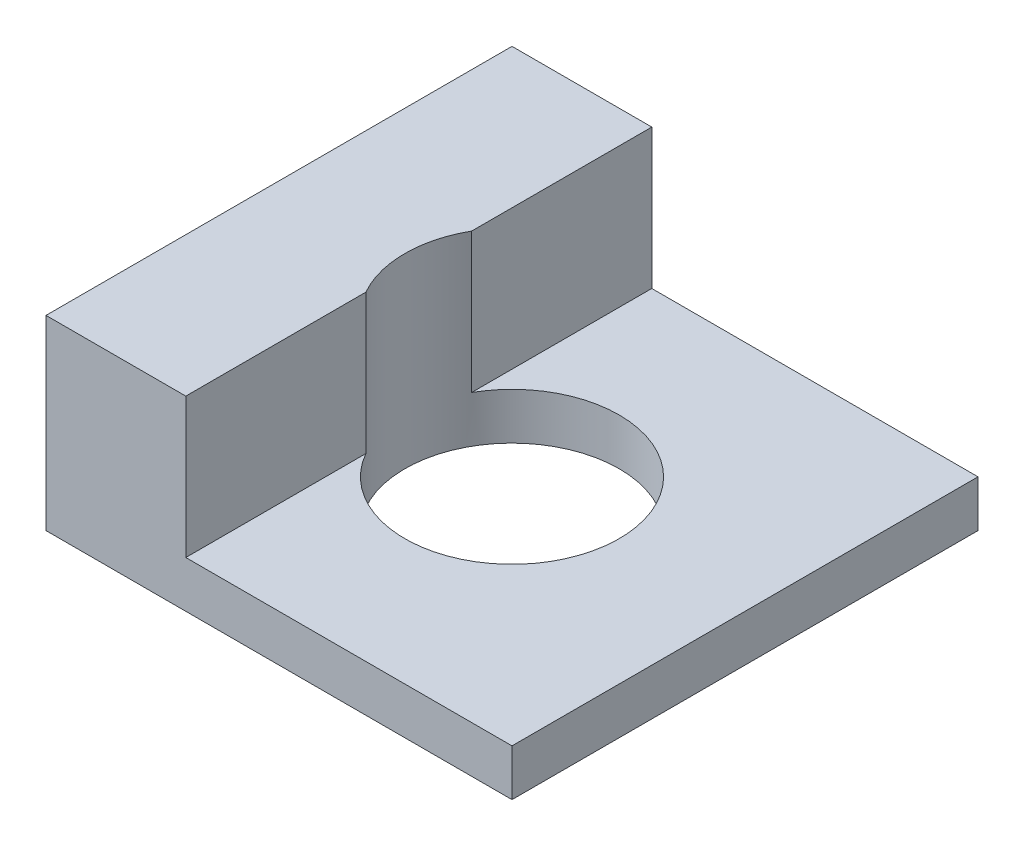
ISO-10303-21;
HEADER;
FILE_DESCRIPTION(('STEP AP214'),'2;1');
FILE_NAME('part.step','',(''),(''),'','','');
FILE_SCHEMA(('AUTOMOTIVE_DESIGN { 1 0 10303 214 1 1 1 1 }'));
ENDSEC;
DATA;
#1=APPLICATION_CONTEXT('core data for automotive mechanical design processes');
#2=APPLICATION_PROTOCOL_DEFINITION('international standard','automotive_design',2000,#1);
#3=PRODUCT_CONTEXT('',#1,'mechanical');
#4=PRODUCT('Part','Part','',(#3));
#5=PRODUCT_RELATED_PRODUCT_CATEGORY('part','',(#4));
#6=PRODUCT_DEFINITION_FORMATION('','',#4);
#7=PRODUCT_DEFINITION_CONTEXT('part definition',#1,'design');
#8=PRODUCT_DEFINITION('design','',#6,#7);
#9=PRODUCT_DEFINITION_SHAPE('','',#8);
#10=(LENGTH_UNIT() NAMED_UNIT(*) SI_UNIT(.MILLI.,.METRE.));
#11=(NAMED_UNIT(*) PLANE_ANGLE_UNIT() SI_UNIT($,.RADIAN.));
#12=(NAMED_UNIT(*) SI_UNIT($,.STERADIAN.) SOLID_ANGLE_UNIT());
#13=UNCERTAINTY_MEASURE_WITH_UNIT(LENGTH_MEASURE(1.E-05),#10,'distance_accuracy_value','');
#14=(GEOMETRIC_REPRESENTATION_CONTEXT(3) GLOBAL_UNCERTAINTY_ASSIGNED_CONTEXT((#13)) GLOBAL_UNIT_ASSIGNED_CONTEXT((#10,
#11,#12)) REPRESENTATION_CONTEXT('',''));
#15=CARTESIAN_POINT('',(0.,0.,0.));
#16=DIRECTION('',(0.,0.,1.));
#17=DIRECTION('',(1.,0.,0.));
#18=AXIS2_PLACEMENT_3D('',#15,#16,#17);
#19=CARTESIAN_POINT('',(50.,20.,0.));
#20=DIRECTION('',(-1.,0.,0.));
#21=DIRECTION('',(0.,0.,1.));
#22=AXIS2_PLACEMENT_3D('',#19,#20,#21);
#23=PLANE('',#22);
#24=DIRECTION('',(0.,0.,-1.));
#25=VECTOR('',#24,1.);
#26=CARTESIAN_POINT('',(50.,5.,0.));
#27=LINE('',#26,#25);
#28=CARTESIAN_POINT('',(50.,5.,0.));
#29=VERTEX_POINT('',#28);
#30=CARTESIAN_POINT('',(50.,5.,-50.));
#31=VERTEX_POINT('',#30);
#32=EDGE_CURVE('E149',#29,#31,#27,.T.);
#33=ORIENTED_EDGE('',*,*,#32,.F.);
#34=DIRECTION('',(0.,-1.,0.));
#35=VECTOR('',#34,1.);
#36=CARTESIAN_POINT('',(50.,20.,0.));
#37=LINE('',#36,#35);
#38=CARTESIAN_POINT('',(50.,0.,0.));
#39=VERTEX_POINT('',#38);
#40=EDGE_CURVE('E109',#29,#39,#37,.T.);
#41=ORIENTED_EDGE('',*,*,#40,.T.);
#42=DIRECTION('',(0.,0.,-1.));
#43=VECTOR('',#42,1.);
#44=CARTESIAN_POINT('',(50.,0.,0.));
#45=LINE('',#44,#43);
#46=CARTESIAN_POINT('',(50.,0.,-50.));
#47=VERTEX_POINT('',#46);
#48=EDGE_CURVE('E87',#39,#47,#45,.T.);
#49=ORIENTED_EDGE('',*,*,#48,.T.);
#50=DIRECTION('',(0.,-1.,0.));
#51=VECTOR('',#50,1.);
#52=CARTESIAN_POINT('',(50.,20.,-50.));
#53=LINE('',#52,#51);
#54=EDGE_CURVE('E81',#31,#47,#53,.T.);
#55=ORIENTED_EDGE('',*,*,#54,.F.);
#56=EDGE_LOOP('',(#33,#41,#49,#55));
#57=FACE_BOUND('',#56,.T.);
#58=ADVANCED_FACE('F31',(#57),#23,.F.);
#59=CARTESIAN_POINT('',(0.,20.,0.));
#60=DIRECTION('',(1.,0.,0.));
#61=DIRECTION('',(0.,0.,-1.));
#62=AXIS2_PLACEMENT_3D('',#59,#60,#61);
#63=PLANE('',#62);
#64=DIRECTION('',(0.,0.,1.));
#65=VECTOR('',#64,1.);
#66=CARTESIAN_POINT('',(0.,0.,0.));
#67=LINE('',#66,#65);
#68=CARTESIAN_POINT('',(0.,0.,-50.));
#69=VERTEX_POINT('',#68);
#70=CARTESIAN_POINT('',(0.,0.,0.));
#71=VERTEX_POINT('',#70);
#72=EDGE_CURVE('E92',#69,#71,#67,.T.);
#73=ORIENTED_EDGE('',*,*,#72,.T.);
#74=DIRECTION('',(0.,-1.,0.));
#75=VECTOR('',#74,1.);
#76=CARTESIAN_POINT('',(0.,20.,0.));
#77=LINE('',#76,#75);
#78=CARTESIAN_POINT('',(0.,20.,0.));
#79=VERTEX_POINT('',#78);
#80=EDGE_CURVE('E111',#79,#71,#77,.T.);
#81=ORIENTED_EDGE('',*,*,#80,.F.);
#82=DIRECTION('',(0.,0.,1.));
#83=VECTOR('',#82,1.);
#84=CARTESIAN_POINT('',(0.,20.,0.));
#85=LINE('',#84,#83);
#86=CARTESIAN_POINT('',(0.,20.,-50.));
#87=VERTEX_POINT('',#86);
#88=EDGE_CURVE('E86',#87,#79,#85,.T.);
#89=ORIENTED_EDGE('',*,*,#88,.F.);
#90=DIRECTION('',(0.,-1.,0.));
#91=VECTOR('',#90,1.);
#92=CARTESIAN_POINT('',(0.,20.,-50.));
#93=LINE('',#92,#91);
#94=EDGE_CURVE('E77',#87,#69,#93,.T.);
#95=ORIENTED_EDGE('',*,*,#94,.T.);
#96=EDGE_LOOP('',(#73,#81,#89,#95));
#97=FACE_BOUND('',#96,.T.);
#98=ADVANCED_FACE('F33',(#97),#63,.F.);
#99=CARTESIAN_POINT('',(0.,20.,0.));
#100=DIRECTION('',(0.,0.,-1.));
#101=DIRECTION('',(-1.,0.,0.));
#102=AXIS2_PLACEMENT_3D('',#99,#100,#101);
#103=PLANE('',#102);
#104=DIRECTION('',(1.,0.,0.));
#105=VECTOR('',#104,1.);
#106=CARTESIAN_POINT('',(0.,5.,0.));
#107=LINE('',#106,#105);
#108=CARTESIAN_POINT('',(15.,5.,0.));
#109=VERTEX_POINT('',#108);
#110=EDGE_CURVE('E152',#109,#29,#107,.T.);
#111=ORIENTED_EDGE('',*,*,#110,.F.);
#112=DIRECTION('',(0.,1.,0.));
#113=VECTOR('',#112,1.);
#114=CARTESIAN_POINT('',(15.,20.,0.));
#115=LINE('',#114,#113);
#116=CARTESIAN_POINT('',(15.,20.,0.));
#117=VERTEX_POINT('',#116);
#118=EDGE_CURVE('E158',#109,#117,#115,.T.);
#119=ORIENTED_EDGE('',*,*,#118,.T.);
#120=DIRECTION('',(1.,0.,0.));
#121=VECTOR('',#120,1.);
#122=CARTESIAN_POINT('',(0.,20.,0.));
#123=LINE('',#122,#121);
#124=EDGE_CURVE('E141',#79,#117,#123,.T.);
#125=ORIENTED_EDGE('',*,*,#124,.F.);
#126=ORIENTED_EDGE('',*,*,#80,.T.);
#127=DIRECTION('',(1.,0.,0.));
#128=VECTOR('',#127,1.);
#129=CARTESIAN_POINT('',(0.,0.,0.));
#130=LINE('',#129,#128);
#131=EDGE_CURVE('E96',#71,#39,#130,.T.);
#132=ORIENTED_EDGE('',*,*,#131,.T.);
#133=ORIENTED_EDGE('',*,*,#40,.F.);
#134=EDGE_LOOP('',(#111,#119,#125,#126,#132,#133));
#135=FACE_BOUND('',#134,.T.);
#136=ADVANCED_FACE('F164',(#135),#103,.F.);
#137=CARTESIAN_POINT('',(0.,20.,-50.));
#138=DIRECTION('',(0.,0.,1.));
#139=DIRECTION('',(1.,0.,0.));
#140=AXIS2_PLACEMENT_3D('',#137,#138,#139);
#141=PLANE('',#140);
#142=DIRECTION('',(-1.,0.,0.));
#143=VECTOR('',#142,1.);
#144=CARTESIAN_POINT('',(0.,20.,-50.));
#145=LINE('',#144,#143);
#146=CARTESIAN_POINT('',(15.,20.,-50.));
#147=VERTEX_POINT('',#146);
#148=EDGE_CURVE('E55',#147,#87,#145,.T.);
#149=ORIENTED_EDGE('',*,*,#148,.F.);
#150=DIRECTION('',(0.,-1.,0.));
#151=VECTOR('',#150,1.);
#152=CARTESIAN_POINT('',(15.,20.,-50.));
#153=LINE('',#152,#151);
#154=CARTESIAN_POINT('',(15.,5.,-50.));
#155=VERTEX_POINT('',#154);
#156=EDGE_CURVE('E155',#147,#155,#153,.T.);
#157=ORIENTED_EDGE('',*,*,#156,.T.);
#158=DIRECTION('',(-1.,0.,0.));
#159=VECTOR('',#158,1.);
#160=CARTESIAN_POINT('',(0.,5.,-50.));
#161=LINE('',#160,#159);
#162=EDGE_CURVE('E147',#31,#155,#161,.T.);
#163=ORIENTED_EDGE('',*,*,#162,.F.);
#164=ORIENTED_EDGE('',*,*,#54,.T.);
#165=DIRECTION('',(-1.,0.,0.));
#166=VECTOR('',#165,1.);
#167=CARTESIAN_POINT('',(0.,0.,-50.));
#168=LINE('',#167,#166);
#169=EDGE_CURVE('E74',#47,#69,#168,.T.);
#170=ORIENTED_EDGE('',*,*,#169,.T.);
#171=ORIENTED_EDGE('',*,*,#94,.F.);
#172=EDGE_LOOP('',(#149,#157,#163,#164,#170,#171));
#173=FACE_BOUND('',#172,.T.);
#174=ADVANCED_FACE('F76',(#173),#141,.F.);
#175=CARTESIAN_POINT('',(0.,20.,-50.));
#176=DIRECTION('',(0.,-1.,0.));
#177=DIRECTION('',(0.,0.,-1.));
#178=AXIS2_PLACEMENT_3D('',#175,#176,#177);
#179=PLANE('',#178);
#180=ORIENTED_EDGE('',*,*,#124,.T.);
#181=DIRECTION('',(0.,0.,1.));
#182=VECTOR('',#181,1.);
#183=CARTESIAN_POINT('',(15.,20.,-56.0461787710551));
#184=LINE('',#183,#182);
#185=CARTESIAN_POINT('',(15.,20.,-19.3210916541997));
#186=VERTEX_POINT('',#185);
#187=EDGE_CURVE('E133',#186,#117,#184,.T.);
#188=ORIENTED_EDGE('',*,*,#187,.F.);
#189=CARTESIAN_POINT('',(25.,20.,-25.));
#190=DIRECTION('',(0.,-1.,0.));
#191=DIRECTION('',(0.,0.,-1.));
#192=AXIS2_PLACEMENT_3D('',#189,#190,#191);
#193=CIRCLE('',#192,11.5);
#194=CARTESIAN_POINT('',(15.,20.,-30.6789083458003));
#195=VERTEX_POINT('',#194);
#196=EDGE_CURVE('E98',#186,#195,#193,.T.);
#197=ORIENTED_EDGE('',*,*,#196,.T.);
#198=EDGE_CURVE('E142',#147,#195,#184,.T.);
#199=ORIENTED_EDGE('',*,*,#198,.F.);
#200=ORIENTED_EDGE('',*,*,#148,.T.);
#201=ORIENTED_EDGE('',*,*,#88,.T.);
#202=EDGE_LOOP('',(#180,#188,#197,#199,#200,#201));
#203=FACE_BOUND('',#202,.T.);
#204=ADVANCED_FACE('F140',(#203),#179,.F.);
#205=CARTESIAN_POINT('',(0.,0.,-50.));
#206=DIRECTION('',(0.,-1.,0.));
#207=DIRECTION('',(0.,0.,-1.));
#208=AXIS2_PLACEMENT_3D('',#205,#206,#207);
#209=PLANE('',#208);
#210=CARTESIAN_POINT('',(25.,0.,-25.));
#211=DIRECTION('',(0.,-1.,0.));
#212=DIRECTION('',(0.,0.,-1.));
#213=AXIS2_PLACEMENT_3D('',#210,#211,#212);
#214=CIRCLE('',#213,11.5);
#215=CARTESIAN_POINT('',(25.,0.,-36.5));
#216=VERTEX_POINT('',#215);
#217=EDGE_CURVE('E102',#216,#216,#214,.T.);
#218=ORIENTED_EDGE('',*,*,#217,.F.);
#219=EDGE_LOOP('',(#218));
#220=FACE_BOUND('',#219,.T.);
#221=ORIENTED_EDGE('',*,*,#72,.F.);
#222=ORIENTED_EDGE('',*,*,#169,.F.);
#223=ORIENTED_EDGE('',*,*,#48,.F.);
#224=ORIENTED_EDGE('',*,*,#131,.F.);
#225=EDGE_LOOP('',(#221,#222,#223,#224));
#226=FACE_BOUND('',#225,.T.);
#227=ADVANCED_FACE('F94',(#220,#226),#209,.T.);
#228=CARTESIAN_POINT('',(25.,20.,-25.));
#229=DIRECTION('',(0.,-1.,0.));
#230=DIRECTION('',(0.,0.,-1.));
#231=AXIS2_PLACEMENT_3D('',#228,#229,#230);
#232=CYLINDRICAL_SURFACE('',#231,11.5);
#233=CARTESIAN_POINT('',(25.,5.,-25.));
#234=DIRECTION('',(0.,1.,0.));
#235=DIRECTION('',(0.,0.,1.));
#236=AXIS2_PLACEMENT_3D('',#233,#234,#235);
#237=CIRCLE('',#236,11.5);
#238=CARTESIAN_POINT('',(15.,5.,-30.6789083458003));
#239=VERTEX_POINT('',#238);
#240=CARTESIAN_POINT('',(15.,5.,-19.3210916541997));
#241=VERTEX_POINT('',#240);
#242=EDGE_CURVE('E113',#239,#241,#237,.F.);
#243=ORIENTED_EDGE('',*,*,#242,.F.);
#244=DIRECTION('',(0.,-1.,0.));
#245=VECTOR('',#244,1.);
#246=CARTESIAN_POINT('',(15.,20.,-30.6789083458003));
#247=LINE('',#246,#245);
#248=EDGE_CURVE('E11',#239,#195,#247,.F.);
#249=ORIENTED_EDGE('',*,*,#248,.T.);
#250=ORIENTED_EDGE('',*,*,#196,.F.);
#251=DIRECTION('',(0.,-1.,0.));
#252=VECTOR('',#251,1.);
#253=CARTESIAN_POINT('',(15.,20.,-19.3210916541997));
#254=LINE('',#253,#252);
#255=EDGE_CURVE('E39',#186,#241,#254,.T.);
#256=ORIENTED_EDGE('',*,*,#255,.T.);
#257=EDGE_LOOP('',(#243,#249,#250,#256));
#258=FACE_BOUND('',#257,.T.);
#259=ORIENTED_EDGE('',*,*,#217,.T.);
#260=EDGE_LOOP('',(#259));
#261=FACE_BOUND('',#260,.T.);
#262=ADVANCED_FACE('F120',(#258,#261),#232,.F.);
#263=CARTESIAN_POINT('',(15.,5.,-56.0461787710551));
#264=DIRECTION('',(-1.,0.,0.));
#265=DIRECTION('',(0.,0.,1.));
#266=AXIS2_PLACEMENT_3D('',#263,#264,#265);
#267=PLANE('',#266);
#268=DIRECTION('',(0.,0.,1.));
#269=VECTOR('',#268,1.);
#270=CARTESIAN_POINT('',(15.,5.,-56.0461787710551));
#271=LINE('',#270,#269);
#272=EDGE_CURVE('E136',#241,#109,#271,.T.);
#273=ORIENTED_EDGE('',*,*,#272,.F.);
#274=ORIENTED_EDGE('',*,*,#255,.F.);
#275=ORIENTED_EDGE('',*,*,#187,.T.);
#276=ORIENTED_EDGE('',*,*,#118,.F.);
#277=EDGE_LOOP('',(#273,#274,#275,#276));
#278=FACE_BOUND('',#277,.T.);
#279=ADVANCED_FACE('F130',(#278),#267,.F.);
#280=ORIENTED_EDGE('',*,*,#198,.T.);
#281=ORIENTED_EDGE('',*,*,#248,.F.);
#282=EDGE_CURVE('E46',#155,#239,#271,.T.);
#283=ORIENTED_EDGE('',*,*,#282,.F.);
#284=ORIENTED_EDGE('',*,*,#156,.F.);
#285=EDGE_LOOP('',(#280,#281,#283,#284));
#286=FACE_BOUND('',#285,.T.);
#287=ADVANCED_FACE('F179',(#286),#267,.F.);
#288=CARTESIAN_POINT('',(15.,5.,2.87944020334407));
#289=DIRECTION('',(0.,1.,0.));
#290=DIRECTION('',(0.,0.,1.));
#291=AXIS2_PLACEMENT_3D('',#288,#289,#290);
#292=PLANE('',#291);
#293=ORIENTED_EDGE('',*,*,#110,.T.);
#294=ORIENTED_EDGE('',*,*,#32,.T.);
#295=ORIENTED_EDGE('',*,*,#162,.T.);
#296=ORIENTED_EDGE('',*,*,#282,.T.);
#297=ORIENTED_EDGE('',*,*,#242,.T.);
#298=ORIENTED_EDGE('',*,*,#272,.T.);
#299=EDGE_LOOP('',(#293,#294,#295,#296,#297,#298));
#300=FACE_BOUND('',#299,.T.);
#301=ADVANCED_FACE('F169',(#300),#292,.T.);
#302=CLOSED_SHELL('',(#58,#98,#136,#174,#204,#227,#262,#279,#287,#301));
#303=MANIFOLD_SOLID_BREP('B2',#302);
#304=ADVANCED_BREP_SHAPE_REPRESENTATION('',(#18,#303),#14);
#305=SHAPE_DEFINITION_REPRESENTATION(#9,#304);
ENDSEC;
END-ISO-10303-21;
